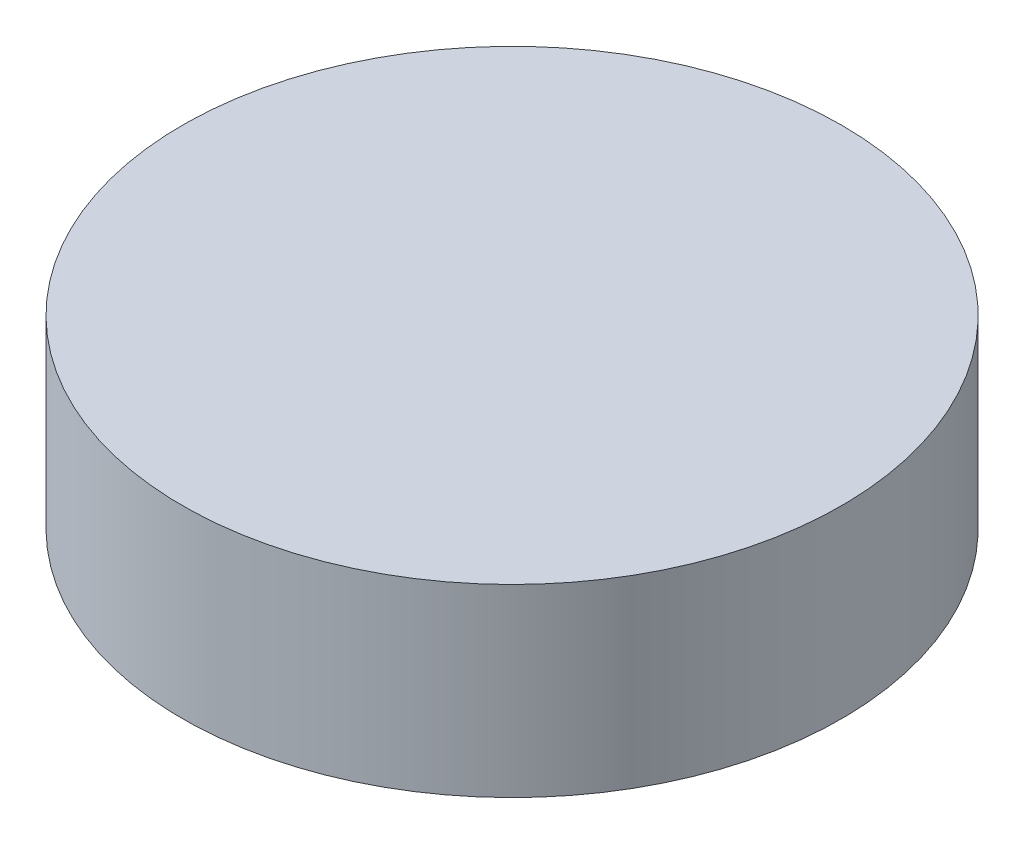
ISO-10303-21;
HEADER;
FILE_DESCRIPTION(('STEP AP214'),'2;1');
FILE_NAME('part.step','',(''),(''),'','','');
FILE_SCHEMA(('AUTOMOTIVE_DESIGN { 1 0 10303 214 1 1 1 1 }'));
ENDSEC;
DATA;
#1=APPLICATION_CONTEXT('core data for automotive mechanical design processes');
#2=APPLICATION_PROTOCOL_DEFINITION('international standard','automotive_design',2000,#1);
#3=PRODUCT_CONTEXT('',#1,'mechanical');
#4=PRODUCT('Part','Part','',(#3));
#5=PRODUCT_RELATED_PRODUCT_CATEGORY('part','',(#4));
#6=PRODUCT_DEFINITION_FORMATION('','',#4);
#7=PRODUCT_DEFINITION_CONTEXT('part definition',#1,'design');
#8=PRODUCT_DEFINITION('design','',#6,#7);
#9=PRODUCT_DEFINITION_SHAPE('','',#8);
#10=(LENGTH_UNIT() NAMED_UNIT(*) SI_UNIT(.MILLI.,.METRE.));
#11=(NAMED_UNIT(*) PLANE_ANGLE_UNIT() SI_UNIT($,.RADIAN.));
#12=(NAMED_UNIT(*) SI_UNIT($,.STERADIAN.) SOLID_ANGLE_UNIT());
#13=UNCERTAINTY_MEASURE_WITH_UNIT(LENGTH_MEASURE(1.E-05),#10,'distance_accuracy_value','');
#14=(GEOMETRIC_REPRESENTATION_CONTEXT(3) GLOBAL_UNCERTAINTY_ASSIGNED_CONTEXT((#13)) GLOBAL_UNIT_ASSIGNED_CONTEXT((#10,
#11,#12)) REPRESENTATION_CONTEXT('',''));
#15=CARTESIAN_POINT('',(0.,0.,0.));
#16=DIRECTION('',(0.,0.,1.));
#17=DIRECTION('',(1.,0.,0.));
#18=AXIS2_PLACEMENT_3D('',#15,#16,#17);
#19=CARTESIAN_POINT('',(0.,0.,25.));
#20=DIRECTION('',(0.,-1.,0.));
#21=DIRECTION('',(0.,0.,-1.));
#22=AXIS2_PLACEMENT_3D('',#19,#20,#21);
#23=PLANE('',#22);
#24=CARTESIAN_POINT('',(0.,0.,0.));
#25=DIRECTION('',(0.,-1.,0.));
#26=DIRECTION('',(0.,0.,-1.));
#27=AXIS2_PLACEMENT_3D('',#24,#25,#26);
#28=CIRCLE('',#27,12.5);
#29=CARTESIAN_POINT('',(0.,0.,-12.5));
#30=VERTEX_POINT('',#29);
#31=EDGE_CURVE('E10',#30,#30,#28,.T.);
#32=ORIENTED_EDGE('',*,*,#31,.F.);
#33=EDGE_LOOP('',(#32));
#34=FACE_BOUND('',#33,.T.);
#35=ADVANCED_FACE('F38',(#34),#23,.F.);
#36=CARTESIAN_POINT('',(0.,-2.,-8.));
#37=DIRECTION('',(0.,-1.,0.));
#38=DIRECTION('',(0.,0.,-1.));
#39=AXIS2_PLACEMENT_3D('',#36,#37,#38);
#40=PLANE('',#39);
#41=CARTESIAN_POINT('',(0.,-2.,-8.));
#42=DIRECTION('',(0.,-1.,0.));
#43=DIRECTION('',(0.,0.,-1.));
#44=AXIS2_PLACEMENT_3D('',#41,#42,#43);
#45=CIRCLE('',#44,1.5);
#46=CARTESIAN_POINT('',(0.,-2.,-9.5));
#47=VERTEX_POINT('',#46);
#48=EDGE_CURVE('E55',#47,#47,#45,.T.);
#49=ORIENTED_EDGE('',*,*,#48,.T.);
#50=EDGE_LOOP('',(#49));
#51=FACE_BOUND('',#50,.T.);
#52=ADVANCED_FACE('F110',(#51),#40,.T.);
#53=CARTESIAN_POINT('',(0.,-2.,8.));
#54=DIRECTION('',(0.,-1.,0.));
#55=DIRECTION('',(0.,0.,-1.));
#56=AXIS2_PLACEMENT_3D('',#53,#54,#55);
#57=PLANE('',#56);
#58=CARTESIAN_POINT('',(0.,-2.,8.));
#59=DIRECTION('',(0.,-1.,0.));
#60=DIRECTION('',(0.,0.,-1.));
#61=AXIS2_PLACEMENT_3D('',#58,#59,#60);
#62=CIRCLE('',#61,1.5);
#63=CARTESIAN_POINT('',(0.,-2.,6.5));
#64=VERTEX_POINT('',#63);
#65=EDGE_CURVE('E61',#64,#64,#62,.T.);
#66=ORIENTED_EDGE('',*,*,#65,.T.);
#67=EDGE_LOOP('',(#66));
#68=FACE_BOUND('',#67,.T.);
#69=ADVANCED_FACE('F116',(#68),#57,.T.);
#70=CARTESIAN_POINT('',(-9.5,-2.,0.));
#71=DIRECTION('',(0.,-1.,0.));
#72=DIRECTION('',(0.,0.,-1.));
#73=AXIS2_PLACEMENT_3D('',#70,#71,#72);
#74=PLANE('',#73);
#75=CARTESIAN_POINT('',(-9.5,-2.,0.));
#76=DIRECTION('',(0.,-1.,0.));
#77=DIRECTION('',(0.,0.,-1.));
#78=AXIS2_PLACEMENT_3D('',#75,#76,#77);
#79=CIRCLE('',#78,1.5);
#80=CARTESIAN_POINT('',(-9.5,-2.,-1.5));
#81=VERTEX_POINT('',#80);
#82=EDGE_CURVE('E67',#81,#81,#79,.T.);
#83=ORIENTED_EDGE('',*,*,#82,.T.);
#84=EDGE_LOOP('',(#83));
#85=FACE_BOUND('',#84,.T.);
#86=ADVANCED_FACE('F103',(#85),#74,.T.);
#87=CARTESIAN_POINT('',(9.5,-2.,0.));
#88=DIRECTION('',(0.,-1.,0.));
#89=DIRECTION('',(0.,0.,-1.));
#90=AXIS2_PLACEMENT_3D('',#87,#88,#89);
#91=PLANE('',#90);
#92=CARTESIAN_POINT('',(9.5,-2.,0.));
#93=DIRECTION('',(0.,-1.,0.));
#94=DIRECTION('',(0.,0.,-1.));
#95=AXIS2_PLACEMENT_3D('',#92,#93,#94);
#96=CIRCLE('',#95,1.5);
#97=CARTESIAN_POINT('',(9.5,-2.,-1.5));
#98=VERTEX_POINT('',#97);
#99=EDGE_CURVE('E48',#98,#98,#96,.T.);
#100=ORIENTED_EDGE('',*,*,#99,.T.);
#101=EDGE_LOOP('',(#100));
#102=FACE_BOUND('',#101,.T.);
#103=ADVANCED_FACE('F92',(#102),#91,.T.);
#104=CARTESIAN_POINT('',(0.,-2.,-8.));
#105=DIRECTION('',(0.,-1.,0.));
#106=DIRECTION('',(0.,0.,-1.));
#107=AXIS2_PLACEMENT_3D('',#104,#105,#106);
#108=CYLINDRICAL_SURFACE('',#107,1.5);
#109=ORIENTED_EDGE('',*,*,#48,.F.);
#110=EDGE_LOOP('',(#109));
#111=FACE_BOUND('',#110,.T.);
#112=CARTESIAN_POINT('',(0.,-7.,-8.));
#113=DIRECTION('',(0.,-1.,0.));
#114=DIRECTION('',(0.,0.,-1.));
#115=AXIS2_PLACEMENT_3D('',#112,#113,#114);
#116=CIRCLE('',#115,1.5);
#117=CARTESIAN_POINT('',(0.,-7.,-9.5));
#118=VERTEX_POINT('',#117);
#119=EDGE_CURVE('E58',#118,#118,#116,.T.);
#120=ORIENTED_EDGE('',*,*,#119,.T.);
#121=EDGE_LOOP('',(#120));
#122=FACE_BOUND('',#121,.T.);
#123=ADVANCED_FACE('F89',(#111,#122),#108,.F.);
#124=CARTESIAN_POINT('',(0.,-2.,8.));
#125=DIRECTION('',(0.,-1.,0.));
#126=DIRECTION('',(0.,0.,-1.));
#127=AXIS2_PLACEMENT_3D('',#124,#125,#126);
#128=CYLINDRICAL_SURFACE('',#127,1.5);
#129=ORIENTED_EDGE('',*,*,#65,.F.);
#130=EDGE_LOOP('',(#129));
#131=FACE_BOUND('',#130,.T.);
#132=CARTESIAN_POINT('',(0.,-7.,8.));
#133=DIRECTION('',(0.,-1.,0.));
#134=DIRECTION('',(0.,0.,-1.));
#135=AXIS2_PLACEMENT_3D('',#132,#133,#134);
#136=CIRCLE('',#135,1.5);
#137=CARTESIAN_POINT('',(0.,-7.,6.5));
#138=VERTEX_POINT('',#137);
#139=EDGE_CURVE('E64',#138,#138,#136,.T.);
#140=ORIENTED_EDGE('',*,*,#139,.T.);
#141=EDGE_LOOP('',(#140));
#142=FACE_BOUND('',#141,.T.);
#143=ADVANCED_FACE('F91',(#131,#142),#128,.F.);
#144=CARTESIAN_POINT('',(-9.5,-2.,0.));
#145=DIRECTION('',(0.,-1.,0.));
#146=DIRECTION('',(0.,0.,-1.));
#147=AXIS2_PLACEMENT_3D('',#144,#145,#146);
#148=CYLINDRICAL_SURFACE('',#147,1.5);
#149=ORIENTED_EDGE('',*,*,#82,.F.);
#150=EDGE_LOOP('',(#149));
#151=FACE_BOUND('',#150,.T.);
#152=CARTESIAN_POINT('',(-9.5,-7.,0.));
#153=DIRECTION('',(0.,-1.,0.));
#154=DIRECTION('',(0.,0.,-1.));
#155=AXIS2_PLACEMENT_3D('',#152,#153,#154);
#156=CIRCLE('',#155,1.5);
#157=CARTESIAN_POINT('',(-9.5,-7.,-1.5));
#158=VERTEX_POINT('',#157);
#159=EDGE_CURVE('E70',#158,#158,#156,.T.);
#160=ORIENTED_EDGE('',*,*,#159,.T.);
#161=EDGE_LOOP('',(#160));
#162=FACE_BOUND('',#161,.T.);
#163=ADVANCED_FACE('F100',(#151,#162),#148,.F.);
#164=CARTESIAN_POINT('',(9.5,-2.,0.));
#165=DIRECTION('',(0.,-1.,0.));
#166=DIRECTION('',(0.,0.,-1.));
#167=AXIS2_PLACEMENT_3D('',#164,#165,#166);
#168=CYLINDRICAL_SURFACE('',#167,1.5);
#169=ORIENTED_EDGE('',*,*,#99,.F.);
#170=EDGE_LOOP('',(#169));
#171=FACE_BOUND('',#170,.T.);
#172=CARTESIAN_POINT('',(9.5,-7.,0.));
#173=DIRECTION('',(0.,-1.,0.));
#174=DIRECTION('',(0.,0.,-1.));
#175=AXIS2_PLACEMENT_3D('',#172,#173,#174);
#176=CIRCLE('',#175,1.5);
#177=CARTESIAN_POINT('',(9.5,-7.,-1.5));
#178=VERTEX_POINT('',#177);
#179=EDGE_CURVE('E52',#178,#178,#176,.T.);
#180=ORIENTED_EDGE('',*,*,#179,.T.);
#181=EDGE_LOOP('',(#180));
#182=FACE_BOUND('',#181,.T.);
#183=ADVANCED_FACE('F76',(#171,#182),#168,.F.);
#184=CARTESIAN_POINT('',(0.,-7.,0.));
#185=DIRECTION('',(0.,-1.,0.));
#186=DIRECTION('',(0.,0.,-1.));
#187=AXIS2_PLACEMENT_3D('',#184,#185,#186);
#188=PLANE('',#187);
#189=ORIENTED_EDGE('',*,*,#179,.F.);
#190=EDGE_LOOP('',(#189));
#191=FACE_BOUND('',#190,.T.);
#192=ORIENTED_EDGE('',*,*,#159,.F.);
#193=EDGE_LOOP('',(#192));
#194=FACE_BOUND('',#193,.T.);
#195=ORIENTED_EDGE('',*,*,#139,.F.);
#196=EDGE_LOOP('',(#195));
#197=FACE_BOUND('',#196,.T.);
#198=ORIENTED_EDGE('',*,*,#119,.F.);
#199=EDGE_LOOP('',(#198));
#200=FACE_BOUND('',#199,.T.);
#201=CARTESIAN_POINT('',(0.,-7.,0.));
#202=DIRECTION('',(0.,-1.,0.));
#203=DIRECTION('',(0.,0.,-1.));
#204=AXIS2_PLACEMENT_3D('',#201,#202,#203);
#205=CIRCLE('',#204,12.5);
#206=CARTESIAN_POINT('',(0.,-7.,-12.5));
#207=VERTEX_POINT('',#206);
#208=EDGE_CURVE('E44',#207,#207,#205,.T.);
#209=ORIENTED_EDGE('',*,*,#208,.T.);
#210=EDGE_LOOP('',(#209));
#211=FACE_BOUND('',#210,.T.);
#212=ADVANCED_FACE('F78',(#191,#194,#197,#200,#211),#188,.T.);
#213=CARTESIAN_POINT('',(0.,-7.,0.));
#214=DIRECTION('',(0.,1.,0.));
#215=DIRECTION('',(0.,0.,1.));
#216=AXIS2_PLACEMENT_3D('',#213,#214,#215);
#217=CYLINDRICAL_SURFACE('',#216,12.5);
#218=ORIENTED_EDGE('',*,*,#208,.F.);
#219=EDGE_LOOP('',(#218));
#220=FACE_BOUND('',#219,.T.);
#221=ORIENTED_EDGE('',*,*,#31,.T.);
#222=EDGE_LOOP('',(#221));
#223=FACE_BOUND('',#222,.T.);
#224=ADVANCED_FACE('F81',(#220,#223),#217,.T.);
#225=CLOSED_SHELL('',(#35,#52,#69,#86,#103,#123,#143,#163,#183,#212,#224));
#226=MANIFOLD_SOLID_BREP('B2',#225);
#227=ADVANCED_BREP_SHAPE_REPRESENTATION('',(#18,#226),#14);
#228=SHAPE_DEFINITION_REPRESENTATION(#9,#227);
ENDSEC;
END-ISO-10303-21;
